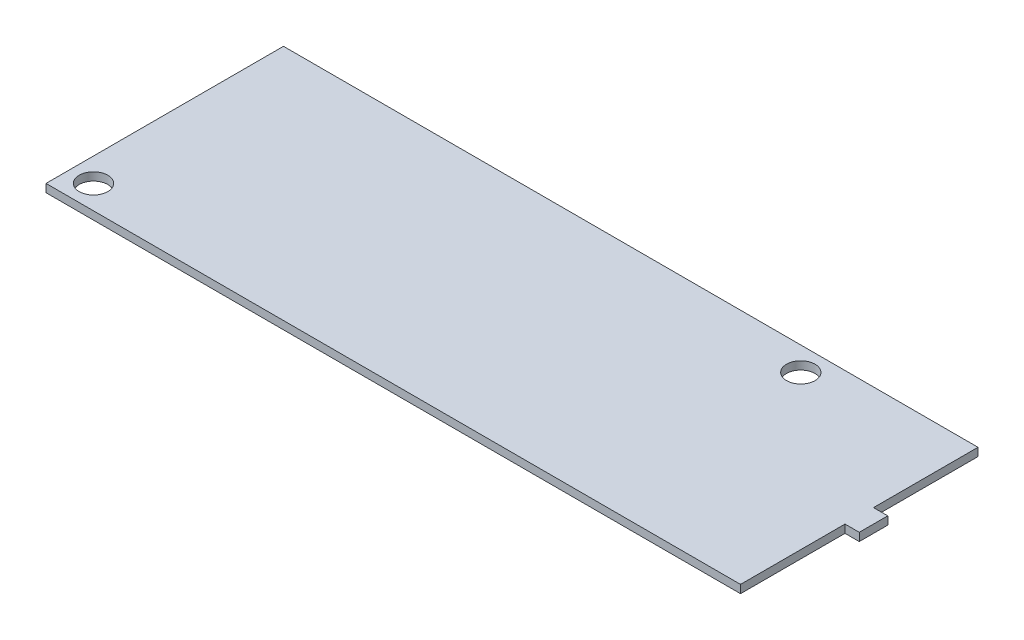
ISO-10303-21;
HEADER;
FILE_DESCRIPTION(('STEP AP214'),'2;1');
FILE_NAME('part.step','',(''),(''),'','','');
FILE_SCHEMA(('AUTOMOTIVE_DESIGN { 1 0 10303 214 1 1 1 1 }'));
ENDSEC;
DATA;
#1=APPLICATION_CONTEXT('core data for automotive mechanical design processes');
#2=APPLICATION_PROTOCOL_DEFINITION('international standard','automotive_design',2000,#1);
#3=PRODUCT_CONTEXT('',#1,'mechanical');
#4=PRODUCT('Part','Part','',(#3));
#5=PRODUCT_RELATED_PRODUCT_CATEGORY('part','',(#4));
#6=PRODUCT_DEFINITION_FORMATION('','',#4);
#7=PRODUCT_DEFINITION_CONTEXT('part definition',#1,'design');
#8=PRODUCT_DEFINITION('design','',#6,#7);
#9=PRODUCT_DEFINITION_SHAPE('','',#8);
#10=(LENGTH_UNIT() NAMED_UNIT(*) SI_UNIT(.MILLI.,.METRE.));
#11=(NAMED_UNIT(*) PLANE_ANGLE_UNIT() SI_UNIT($,.RADIAN.));
#12=(NAMED_UNIT(*) SI_UNIT($,.STERADIAN.) SOLID_ANGLE_UNIT());
#13=UNCERTAINTY_MEASURE_WITH_UNIT(LENGTH_MEASURE(1.E-05),#10,'distance_accuracy_value','');
#14=(GEOMETRIC_REPRESENTATION_CONTEXT(3) GLOBAL_UNCERTAINTY_ASSIGNED_CONTEXT((#13)) GLOBAL_UNIT_ASSIGNED_CONTEXT((#10,
#11,#12)) REPRESENTATION_CONTEXT('',''));
#15=CARTESIAN_POINT('',(0.,0.,0.));
#16=DIRECTION('',(0.,0.,1.));
#17=DIRECTION('',(1.,0.,0.));
#18=AXIS2_PLACEMENT_3D('',#15,#16,#17);
#19=CARTESIAN_POINT('',(0.,1.7,0.));
#20=DIRECTION('',(0.,-1.,0.));
#21=DIRECTION('',(0.,0.,-1.));
#22=AXIS2_PLACEMENT_3D('',#19,#20,#21);
#23=PLANE('',#22);
#24=DIRECTION('',(0.,0.,-1.));
#25=VECTOR('',#24,1.);
#26=CARTESIAN_POINT('',(74.6125,1.7,3.));
#27=LINE('',#26,#25);
#28=CARTESIAN_POINT('',(74.6125,1.7,3.));
#29=VERTEX_POINT('',#28);
#30=CARTESIAN_POINT('',(74.6125,1.7,-3.));
#31=VERTEX_POINT('',#30);
#32=EDGE_CURVE('E146',#29,#31,#27,.T.);
#33=ORIENTED_EDGE('',*,*,#32,.T.);
#34=DIRECTION('',(-1.,0.,0.));
#35=VECTOR('',#34,1.);
#36=CARTESIAN_POINT('',(71.6125,1.7,-3.));
#37=LINE('',#36,#35);
#38=CARTESIAN_POINT('',(71.6125,1.7,-3.));
#39=VERTEX_POINT('',#38);
#40=EDGE_CURVE('E94',#31,#39,#37,.T.);
#41=ORIENTED_EDGE('',*,*,#40,.T.);
#42=DIRECTION('',(0.,0.,-1.));
#43=VECTOR('',#42,1.);
#44=CARTESIAN_POINT('',(71.6125,1.7,-3.));
#45=LINE('',#44,#43);
#46=CARTESIAN_POINT('',(71.6125,1.7,-25.));
#47=VERTEX_POINT('',#46);
#48=EDGE_CURVE('E161',#39,#47,#45,.T.);
#49=ORIENTED_EDGE('',*,*,#48,.T.);
#50=DIRECTION('',(-1.,0.,0.));
#51=VECTOR('',#50,1.);
#52=CARTESIAN_POINT('',(-74.6125,1.7,-25.));
#53=LINE('',#52,#51);
#54=CARTESIAN_POINT('',(-74.6125,1.7,-25.));
#55=VERTEX_POINT('',#54);
#56=EDGE_CURVE('E174',#47,#55,#53,.T.);
#57=ORIENTED_EDGE('',*,*,#56,.T.);
#58=DIRECTION('',(0.,0.,1.));
#59=VECTOR('',#58,1.);
#60=CARTESIAN_POINT('',(-74.6125,1.7,25.));
#61=LINE('',#60,#59);
#62=CARTESIAN_POINT('',(-74.6125,1.7,25.));
#63=VERTEX_POINT('',#62);
#64=EDGE_CURVE('E113',#55,#63,#61,.T.);
#65=ORIENTED_EDGE('',*,*,#64,.T.);
#66=DIRECTION('',(1.,0.,0.));
#67=VECTOR('',#66,1.);
#68=CARTESIAN_POINT('',(71.6125,1.7,25.));
#69=LINE('',#68,#67);
#70=CARTESIAN_POINT('',(71.6125,1.7,25.));
#71=VERTEX_POINT('',#70);
#72=EDGE_CURVE('E107',#63,#71,#69,.T.);
#73=ORIENTED_EDGE('',*,*,#72,.T.);
#74=DIRECTION('',(0.,0.,-1.));
#75=VECTOR('',#74,1.);
#76=CARTESIAN_POINT('',(71.6125,1.7,25.));
#77=LINE('',#76,#75);
#78=CARTESIAN_POINT('',(71.6125,1.7,3.));
#79=VERTEX_POINT('',#78);
#80=EDGE_CURVE('E111',#71,#79,#77,.T.);
#81=ORIENTED_EDGE('',*,*,#80,.T.);
#82=DIRECTION('',(1.,0.,0.));
#83=VECTOR('',#82,1.);
#84=CARTESIAN_POINT('',(74.6125,1.7,3.));
#85=LINE('',#84,#83);
#86=EDGE_CURVE('E51',#79,#29,#85,.T.);
#87=ORIENTED_EDGE('',*,*,#86,.T.);
#88=EDGE_LOOP('',(#33,#41,#49,#57,#65,#73,#81,#87));
#89=FACE_BOUND('',#88,.T.);
#90=CARTESIAN_POINT('',(39.306,1.7,-20.));
#91=DIRECTION('',(0.,1.,0.));
#92=DIRECTION('',(0.,0.,1.));
#93=AXIS2_PLACEMENT_3D('',#90,#91,#92);
#94=CIRCLE('',#93,3.);
#95=CARTESIAN_POINT('',(39.306,1.7,-17.));
#96=VERTEX_POINT('',#95);
#97=EDGE_CURVE('E135',#96,#96,#94,.T.);
#98=ORIENTED_EDGE('',*,*,#97,.F.);
#99=EDGE_LOOP('',(#98));
#100=FACE_BOUND('',#99,.T.);
#101=CARTESIAN_POINT('',(-69.6125,1.7,20.));
#102=DIRECTION('',(0.,1.,0.));
#103=DIRECTION('',(0.,0.,1.));
#104=AXIS2_PLACEMENT_3D('',#101,#102,#103);
#105=CIRCLE('',#104,2.99999999999999);
#106=CARTESIAN_POINT('',(-69.6125,1.7,23.));
#107=VERTEX_POINT('',#106);
#108=EDGE_CURVE('E183',#107,#107,#105,.T.);
#109=ORIENTED_EDGE('',*,*,#108,.F.);
#110=EDGE_LOOP('',(#109));
#111=FACE_BOUND('',#110,.T.);
#112=ADVANCED_FACE('F34',(#89,#100,#111),#23,.F.);
#113=CARTESIAN_POINT('',(0.,0.,0.));
#114=DIRECTION('',(0.,-1.,0.));
#115=DIRECTION('',(0.,0.,-1.));
#116=AXIS2_PLACEMENT_3D('',#113,#114,#115);
#117=PLANE('',#116);
#118=CARTESIAN_POINT('',(39.306,0.,-20.));
#119=DIRECTION('',(0.,1.,0.));
#120=DIRECTION('',(0.,0.,1.));
#121=AXIS2_PLACEMENT_3D('',#118,#119,#120);
#122=CIRCLE('',#121,3.);
#123=CARTESIAN_POINT('',(39.306,0.,-17.));
#124=VERTEX_POINT('',#123);
#125=EDGE_CURVE('E180',#124,#124,#122,.T.);
#126=ORIENTED_EDGE('',*,*,#125,.T.);
#127=EDGE_LOOP('',(#126));
#128=FACE_BOUND('',#127,.T.);
#129=DIRECTION('',(0.,0.,-1.));
#130=VECTOR('',#129,1.);
#131=CARTESIAN_POINT('',(74.6125,0.,3.));
#132=LINE('',#131,#130);
#133=CARTESIAN_POINT('',(74.6125,0.,3.));
#134=VERTEX_POINT('',#133);
#135=CARTESIAN_POINT('',(74.6125,0.,-3.));
#136=VERTEX_POINT('',#135);
#137=EDGE_CURVE('E131',#134,#136,#132,.T.);
#138=ORIENTED_EDGE('',*,*,#137,.F.);
#139=DIRECTION('',(1.,0.,0.));
#140=VECTOR('',#139,1.);
#141=CARTESIAN_POINT('',(74.6125,0.,3.));
#142=LINE('',#141,#140);
#143=CARTESIAN_POINT('',(71.6125,0.,3.));
#144=VERTEX_POINT('',#143);
#145=EDGE_CURVE('E86',#144,#134,#142,.T.);
#146=ORIENTED_EDGE('',*,*,#145,.F.);
#147=DIRECTION('',(0.,0.,-1.));
#148=VECTOR('',#147,1.);
#149=CARTESIAN_POINT('',(71.6125,0.,25.));
#150=LINE('',#149,#148);
#151=CARTESIAN_POINT('',(71.6125,0.,25.));
#152=VERTEX_POINT('',#151);
#153=EDGE_CURVE('E80',#152,#144,#150,.T.);
#154=ORIENTED_EDGE('',*,*,#153,.F.);
#155=DIRECTION('',(1.,0.,0.));
#156=VECTOR('',#155,1.);
#157=CARTESIAN_POINT('',(71.6125,0.,25.));
#158=LINE('',#157,#156);
#159=CARTESIAN_POINT('',(-74.6125,0.,25.));
#160=VERTEX_POINT('',#159);
#161=EDGE_CURVE('E121',#160,#152,#158,.T.);
#162=ORIENTED_EDGE('',*,*,#161,.F.);
#163=DIRECTION('',(0.,0.,1.));
#164=VECTOR('',#163,1.);
#165=CARTESIAN_POINT('',(-74.6125,0.,25.));
#166=LINE('',#165,#164);
#167=CARTESIAN_POINT('',(-74.6125,0.,-25.));
#168=VERTEX_POINT('',#167);
#169=EDGE_CURVE('E141',#168,#160,#166,.T.);
#170=ORIENTED_EDGE('',*,*,#169,.F.);
#171=DIRECTION('',(-1.,0.,0.));
#172=VECTOR('',#171,1.);
#173=CARTESIAN_POINT('',(-74.6125,0.,-25.));
#174=LINE('',#173,#172);
#175=CARTESIAN_POINT('',(71.6125,0.,-25.));
#176=VERTEX_POINT('',#175);
#177=EDGE_CURVE('E139',#176,#168,#174,.T.);
#178=ORIENTED_EDGE('',*,*,#177,.F.);
#179=DIRECTION('',(0.,0.,-1.));
#180=VECTOR('',#179,1.);
#181=CARTESIAN_POINT('',(71.6125,0.,-3.));
#182=LINE('',#181,#180);
#183=CARTESIAN_POINT('',(71.6125,0.,-3.));
#184=VERTEX_POINT('',#183);
#185=EDGE_CURVE('E137',#184,#176,#182,.T.);
#186=ORIENTED_EDGE('',*,*,#185,.F.);
#187=DIRECTION('',(-1.,0.,0.));
#188=VECTOR('',#187,1.);
#189=CARTESIAN_POINT('',(71.6125,0.,-3.));
#190=LINE('',#189,#188);
#191=EDGE_CURVE('E134',#136,#184,#190,.T.);
#192=ORIENTED_EDGE('',*,*,#191,.F.);
#193=EDGE_LOOP('',(#138,#146,#154,#162,#170,#178,#186,#192));
#194=FACE_BOUND('',#193,.T.);
#195=CARTESIAN_POINT('',(-69.6125,0.,20.));
#196=DIRECTION('',(0.,1.,0.));
#197=DIRECTION('',(0.,0.,1.));
#198=AXIS2_PLACEMENT_3D('',#195,#196,#197);
#199=CIRCLE('',#198,2.99999999999999);
#200=CARTESIAN_POINT('',(-69.6125,0.,23.));
#201=VERTEX_POINT('',#200);
#202=EDGE_CURVE('E186',#201,#201,#199,.T.);
#203=ORIENTED_EDGE('',*,*,#202,.T.);
#204=EDGE_LOOP('',(#203));
#205=FACE_BOUND('',#204,.T.);
#206=ADVANCED_FACE('F165',(#128,#194,#205),#117,.T.);
#207=CARTESIAN_POINT('',(74.6125,1.7,3.));
#208=DIRECTION('',(-1.,0.,0.));
#209=DIRECTION('',(0.,0.,1.));
#210=AXIS2_PLACEMENT_3D('',#207,#208,#209);
#211=PLANE('',#210);
#212=ORIENTED_EDGE('',*,*,#137,.T.);
#213=DIRECTION('',(0.,-1.,0.));
#214=VECTOR('',#213,1.);
#215=CARTESIAN_POINT('',(74.6125,1.7,-3.));
#216=LINE('',#215,#214);
#217=EDGE_CURVE('E11',#31,#136,#216,.T.);
#218=ORIENTED_EDGE('',*,*,#217,.F.);
#219=ORIENTED_EDGE('',*,*,#32,.F.);
#220=DIRECTION('',(0.,-1.,0.));
#221=VECTOR('',#220,1.);
#222=CARTESIAN_POINT('',(74.6125,1.7,3.));
#223=LINE('',#222,#221);
#224=EDGE_CURVE('E127',#29,#134,#223,.T.);
#225=ORIENTED_EDGE('',*,*,#224,.T.);
#226=EDGE_LOOP('',(#212,#218,#219,#225));
#227=FACE_BOUND('',#226,.T.);
#228=ADVANCED_FACE('F36',(#227),#211,.F.);
#229=CARTESIAN_POINT('',(71.6125,1.7,-3.));
#230=DIRECTION('',(0.,0.,1.));
#231=DIRECTION('',(1.,0.,0.));
#232=AXIS2_PLACEMENT_3D('',#229,#230,#231);
#233=PLANE('',#232);
#234=ORIENTED_EDGE('',*,*,#191,.T.);
#235=DIRECTION('',(0.,-1.,0.));
#236=VECTOR('',#235,1.);
#237=CARTESIAN_POINT('',(71.6125,1.7,-3.));
#238=LINE('',#237,#236);
#239=EDGE_CURVE('E43',#39,#184,#238,.T.);
#240=ORIENTED_EDGE('',*,*,#239,.F.);
#241=ORIENTED_EDGE('',*,*,#40,.F.);
#242=ORIENTED_EDGE('',*,*,#217,.T.);
#243=EDGE_LOOP('',(#234,#240,#241,#242));
#244=FACE_BOUND('',#243,.T.);
#245=ADVANCED_FACE('F218',(#244),#233,.F.);
#246=CARTESIAN_POINT('',(71.6125,1.7,-3.));
#247=DIRECTION('',(-1.,0.,0.));
#248=DIRECTION('',(0.,0.,1.));
#249=AXIS2_PLACEMENT_3D('',#246,#247,#248);
#250=PLANE('',#249);
#251=ORIENTED_EDGE('',*,*,#185,.T.);
#252=DIRECTION('',(0.,-1.,0.));
#253=VECTOR('',#252,1.);
#254=CARTESIAN_POINT('',(71.6125,1.7,-25.));
#255=LINE('',#254,#253);
#256=EDGE_CURVE('E153',#47,#176,#255,.T.);
#257=ORIENTED_EDGE('',*,*,#256,.F.);
#258=ORIENTED_EDGE('',*,*,#48,.F.);
#259=ORIENTED_EDGE('',*,*,#239,.T.);
#260=EDGE_LOOP('',(#251,#257,#258,#259));
#261=FACE_BOUND('',#260,.T.);
#262=ADVANCED_FACE('F159',(#261),#250,.F.);
#263=CARTESIAN_POINT('',(-74.6125,1.7,-25.));
#264=DIRECTION('',(0.,0.,1.));
#265=DIRECTION('',(1.,0.,0.));
#266=AXIS2_PLACEMENT_3D('',#263,#264,#265);
#267=PLANE('',#266);
#268=ORIENTED_EDGE('',*,*,#177,.T.);
#269=DIRECTION('',(0.,-1.,0.));
#270=VECTOR('',#269,1.);
#271=CARTESIAN_POINT('',(-74.6125,1.7,-25.));
#272=LINE('',#271,#270);
#273=EDGE_CURVE('E150',#55,#168,#272,.T.);
#274=ORIENTED_EDGE('',*,*,#273,.F.);
#275=ORIENTED_EDGE('',*,*,#56,.F.);
#276=ORIENTED_EDGE('',*,*,#256,.T.);
#277=EDGE_LOOP('',(#268,#274,#275,#276));
#278=FACE_BOUND('',#277,.T.);
#279=ADVANCED_FACE('F170',(#278),#267,.F.);
#280=CARTESIAN_POINT('',(-74.6125,1.7,25.));
#281=DIRECTION('',(1.,0.,0.));
#282=DIRECTION('',(0.,0.,-1.));
#283=AXIS2_PLACEMENT_3D('',#280,#281,#282);
#284=PLANE('',#283);
#285=ORIENTED_EDGE('',*,*,#169,.T.);
#286=DIRECTION('',(0.,-1.,0.));
#287=VECTOR('',#286,1.);
#288=CARTESIAN_POINT('',(-74.6125,1.7,25.));
#289=LINE('',#288,#287);
#290=EDGE_CURVE('E122',#63,#160,#289,.T.);
#291=ORIENTED_EDGE('',*,*,#290,.F.);
#292=ORIENTED_EDGE('',*,*,#64,.F.);
#293=ORIENTED_EDGE('',*,*,#273,.T.);
#294=EDGE_LOOP('',(#285,#291,#292,#293));
#295=FACE_BOUND('',#294,.T.);
#296=ADVANCED_FACE('F173',(#295),#284,.F.);
#297=CARTESIAN_POINT('',(71.6125,1.7,25.));
#298=DIRECTION('',(0.,0.,-1.));
#299=DIRECTION('',(-1.,0.,0.));
#300=AXIS2_PLACEMENT_3D('',#297,#298,#299);
#301=PLANE('',#300);
#302=ORIENTED_EDGE('',*,*,#161,.T.);
#303=DIRECTION('',(0.,-1.,0.));
#304=VECTOR('',#303,1.);
#305=CARTESIAN_POINT('',(71.6125,1.7,25.));
#306=LINE('',#305,#304);
#307=EDGE_CURVE('E118',#71,#152,#306,.T.);
#308=ORIENTED_EDGE('',*,*,#307,.F.);
#309=ORIENTED_EDGE('',*,*,#72,.F.);
#310=ORIENTED_EDGE('',*,*,#290,.T.);
#311=EDGE_LOOP('',(#302,#308,#309,#310));
#312=FACE_BOUND('',#311,.T.);
#313=ADVANCED_FACE('F119',(#312),#301,.F.);
#314=CARTESIAN_POINT('',(71.6125,1.7,25.));
#315=DIRECTION('',(-1.,0.,0.));
#316=DIRECTION('',(0.,0.,1.));
#317=AXIS2_PLACEMENT_3D('',#314,#315,#316);
#318=PLANE('',#317);
#319=ORIENTED_EDGE('',*,*,#153,.T.);
#320=DIRECTION('',(0.,-1.,0.));
#321=VECTOR('',#320,1.);
#322=CARTESIAN_POINT('',(71.6125,1.7,3.));
#323=LINE('',#322,#321);
#324=EDGE_CURVE('E123',#79,#144,#323,.T.);
#325=ORIENTED_EDGE('',*,*,#324,.F.);
#326=ORIENTED_EDGE('',*,*,#80,.F.);
#327=ORIENTED_EDGE('',*,*,#307,.T.);
#328=EDGE_LOOP('',(#319,#325,#326,#327));
#329=FACE_BOUND('',#328,.T.);
#330=ADVANCED_FACE('F125',(#329),#318,.F.);
#331=CARTESIAN_POINT('',(74.6125,1.7,3.));
#332=DIRECTION('',(0.,0.,-1.));
#333=DIRECTION('',(-1.,0.,0.));
#334=AXIS2_PLACEMENT_3D('',#331,#332,#333);
#335=PLANE('',#334);
#336=ORIENTED_EDGE('',*,*,#145,.T.);
#337=ORIENTED_EDGE('',*,*,#224,.F.);
#338=ORIENTED_EDGE('',*,*,#86,.F.);
#339=ORIENTED_EDGE('',*,*,#324,.T.);
#340=EDGE_LOOP('',(#336,#337,#338,#339));
#341=FACE_BOUND('',#340,.T.);
#342=ADVANCED_FACE('F206',(#341),#335,.F.);
#343=CARTESIAN_POINT('',(39.306,1.7,-20.));
#344=DIRECTION('',(0.,-1.,0.));
#345=DIRECTION('',(0.,0.,-1.));
#346=AXIS2_PLACEMENT_3D('',#343,#344,#345);
#347=CYLINDRICAL_SURFACE('',#346,3.);
#348=ORIENTED_EDGE('',*,*,#97,.T.);
#349=EDGE_LOOP('',(#348));
#350=FACE_BOUND('',#349,.T.);
#351=ORIENTED_EDGE('',*,*,#125,.F.);
#352=EDGE_LOOP('',(#351));
#353=FACE_BOUND('',#352,.T.);
#354=ADVANCED_FACE('F203',(#350,#353),#347,.F.);
#355=CARTESIAN_POINT('',(-69.6125,1.7,20.));
#356=DIRECTION('',(0.,-1.,0.));
#357=DIRECTION('',(0.,0.,-1.));
#358=AXIS2_PLACEMENT_3D('',#355,#356,#357);
#359=CYLINDRICAL_SURFACE('',#358,2.99999999999999);
#360=ORIENTED_EDGE('',*,*,#108,.T.);
#361=EDGE_LOOP('',(#360));
#362=FACE_BOUND('',#361,.T.);
#363=ORIENTED_EDGE('',*,*,#202,.F.);
#364=EDGE_LOOP('',(#363));
#365=FACE_BOUND('',#364,.T.);
#366=ADVANCED_FACE('F192',(#362,#365),#359,.F.);
#367=CLOSED_SHELL('',(#112,#206,#228,#245,#262,#279,#296,#313,#330,#342,#354,#366));
#368=MANIFOLD_SOLID_BREP('B2',#367);
#369=ADVANCED_BREP_SHAPE_REPRESENTATION('',(#18,#368),#14);
#370=SHAPE_DEFINITION_REPRESENTATION(#9,#369);
ENDSEC;
END-ISO-10303-21;
